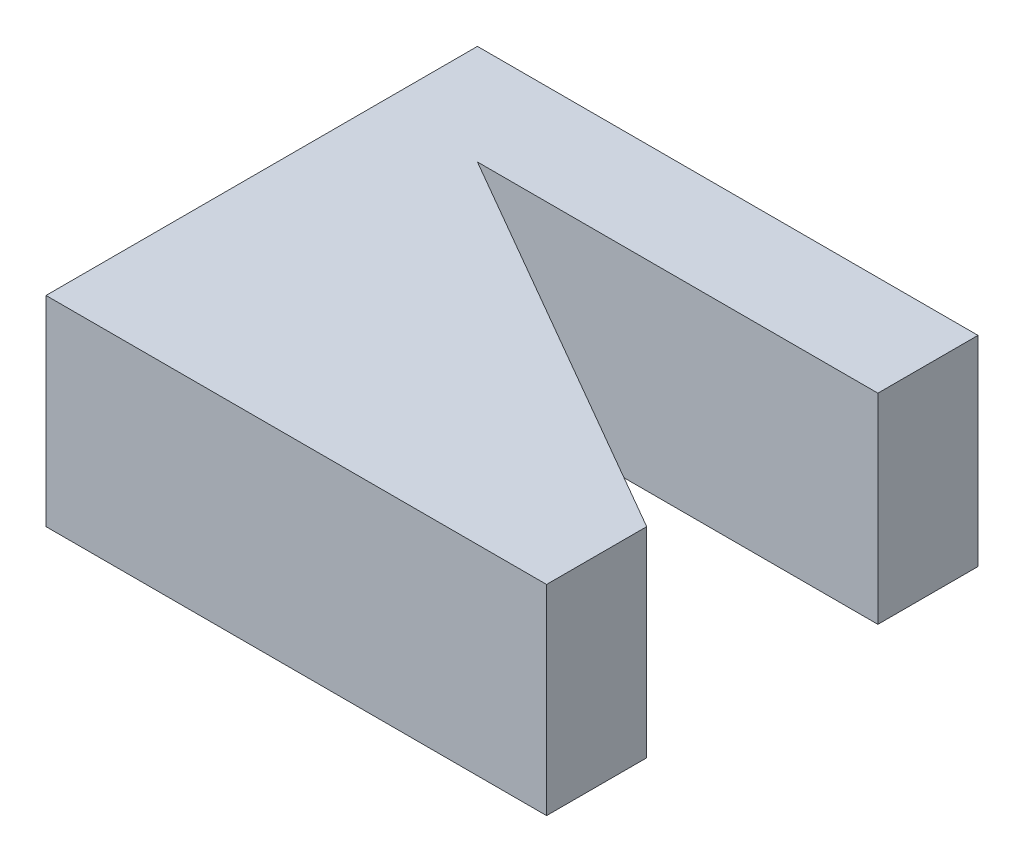
ISO-10303-21;
HEADER;
FILE_DESCRIPTION(('STEP AP214'),'2;1');
FILE_NAME('part.step','',(''),(''),'','','');
FILE_SCHEMA(('AUTOMOTIVE_DESIGN { 1 0 10303 214 1 1 1 1 }'));
ENDSEC;
DATA;
#1=APPLICATION_CONTEXT('core data for automotive mechanical design processes');
#2=APPLICATION_PROTOCOL_DEFINITION('international standard','automotive_design',2000,#1);
#3=PRODUCT_CONTEXT('',#1,'mechanical');
#4=PRODUCT('Part','Part','',(#3));
#5=PRODUCT_RELATED_PRODUCT_CATEGORY('part','',(#4));
#6=PRODUCT_DEFINITION_FORMATION('','',#4);
#7=PRODUCT_DEFINITION_CONTEXT('part definition',#1,'design');
#8=PRODUCT_DEFINITION('design','',#6,#7);
#9=PRODUCT_DEFINITION_SHAPE('','',#8);
#10=(LENGTH_UNIT() NAMED_UNIT(*) SI_UNIT(.MILLI.,.METRE.));
#11=(NAMED_UNIT(*) PLANE_ANGLE_UNIT() SI_UNIT($,.RADIAN.));
#12=(NAMED_UNIT(*) SI_UNIT($,.STERADIAN.) SOLID_ANGLE_UNIT());
#13=UNCERTAINTY_MEASURE_WITH_UNIT(LENGTH_MEASURE(1.E-05),#10,'distance_accuracy_value','');
#14=(GEOMETRIC_REPRESENTATION_CONTEXT(3) GLOBAL_UNCERTAINTY_ASSIGNED_CONTEXT((#13)) GLOBAL_UNIT_ASSIGNED_CONTEXT((#10,
#11,#12)) REPRESENTATION_CONTEXT('',''));
#15=CARTESIAN_POINT('',(0.,0.,0.));
#16=DIRECTION('',(0.,0.,1.));
#17=DIRECTION('',(1.,0.,0.));
#18=AXIS2_PLACEMENT_3D('',#15,#16,#17);
#19=CARTESIAN_POINT('',(10.,20.,10.));
#20=DIRECTION('',(0.,0.,-1.));
#21=DIRECTION('',(-1.,0.,0.));
#22=AXIS2_PLACEMENT_3D('',#19,#20,#21);
#23=PLANE('',#22);
#24=DIRECTION('',(1.,0.,0.));
#25=VECTOR('',#24,1.);
#26=CARTESIAN_POINT('',(10.,0.,10.));
#27=LINE('',#26,#25);
#28=CARTESIAN_POINT('',(10.,0.,10.));
#29=VERTEX_POINT('',#28);
#30=CARTESIAN_POINT('',(50.,0.,10.));
#31=VERTEX_POINT('',#30);
#32=EDGE_CURVE('E135',#29,#31,#27,.T.);
#33=ORIENTED_EDGE('',*,*,#32,.T.);
#34=DIRECTION('',(0.,-1.,0.));
#35=VECTOR('',#34,1.);
#36=CARTESIAN_POINT('',(50.,20.,10.));
#37=LINE('',#36,#35);
#38=CARTESIAN_POINT('',(50.,20.,10.));
#39=VERTEX_POINT('',#38);
#40=EDGE_CURVE('E11',#39,#31,#37,.T.);
#41=ORIENTED_EDGE('',*,*,#40,.F.);
#42=DIRECTION('',(1.,0.,0.));
#43=VECTOR('',#42,1.);
#44=CARTESIAN_POINT('',(10.,20.,10.));
#45=LINE('',#44,#43);
#46=CARTESIAN_POINT('',(10.,20.,10.));
#47=VERTEX_POINT('',#46);
#48=EDGE_CURVE('E156',#47,#39,#45,.T.);
#49=ORIENTED_EDGE('',*,*,#48,.F.);
#50=DIRECTION('',(0.,-1.,0.));
#51=VECTOR('',#50,1.);
#52=CARTESIAN_POINT('',(10.,20.,10.));
#53=LINE('',#52,#51);
#54=EDGE_CURVE('E56',#47,#29,#53,.T.);
#55=ORIENTED_EDGE('',*,*,#54,.T.);
#56=EDGE_LOOP('',(#33,#41,#49,#55));
#57=FACE_BOUND('',#56,.T.);
#58=ADVANCED_FACE('F39',(#57),#23,.F.);
#59=CARTESIAN_POINT('',(50.,20.,10.));
#60=DIRECTION('',(-1.,0.,0.));
#61=DIRECTION('',(0.,0.,1.));
#62=AXIS2_PLACEMENT_3D('',#59,#60,#61);
#63=PLANE('',#62);
#64=DIRECTION('',(0.,0.,-1.));
#65=VECTOR('',#64,1.);
#66=CARTESIAN_POINT('',(50.,0.,10.));
#67=LINE('',#66,#65);
#68=CARTESIAN_POINT('',(50.,0.,0.));
#69=VERTEX_POINT('',#68);
#70=EDGE_CURVE('E138',#31,#69,#67,.T.);
#71=ORIENTED_EDGE('',*,*,#70,.T.);
#72=DIRECTION('',(0.,-1.,0.));
#73=VECTOR('',#72,1.);
#74=CARTESIAN_POINT('',(50.,20.,0.));
#75=LINE('',#74,#73);
#76=CARTESIAN_POINT('',(50.,20.,0.));
#77=VERTEX_POINT('',#76);
#78=EDGE_CURVE('E48',#77,#69,#75,.T.);
#79=ORIENTED_EDGE('',*,*,#78,.F.);
#80=DIRECTION('',(0.,0.,-1.));
#81=VECTOR('',#80,1.);
#82=CARTESIAN_POINT('',(50.,20.,10.));
#83=LINE('',#82,#81);
#84=EDGE_CURVE('E92',#39,#77,#83,.T.);
#85=ORIENTED_EDGE('',*,*,#84,.F.);
#86=ORIENTED_EDGE('',*,*,#40,.T.);
#87=EDGE_LOOP('',(#71,#79,#85,#86));
#88=FACE_BOUND('',#87,.T.);
#89=ADVANCED_FACE('F187',(#88),#63,.F.);
#90=CARTESIAN_POINT('',(50.,20.,0.));
#91=DIRECTION('',(0.,0.,1.));
#92=DIRECTION('',(1.,0.,0.));
#93=AXIS2_PLACEMENT_3D('',#90,#91,#92);
#94=PLANE('',#93);
#95=DIRECTION('',(-1.,0.,0.));
#96=VECTOR('',#95,1.);
#97=CARTESIAN_POINT('',(50.,0.,0.));
#98=LINE('',#97,#96);
#99=CARTESIAN_POINT('',(0.,0.,0.));
#100=VERTEX_POINT('',#99);
#101=EDGE_CURVE('E141',#69,#100,#98,.T.);
#102=ORIENTED_EDGE('',*,*,#101,.T.);
#103=DIRECTION('',(0.,-1.,0.));
#104=VECTOR('',#103,1.);
#105=CARTESIAN_POINT('',(0.,20.,0.));
#106=LINE('',#105,#104);
#107=CARTESIAN_POINT('',(0.,20.,0.));
#108=VERTEX_POINT('',#107);
#109=EDGE_CURVE('E163',#108,#100,#106,.T.);
#110=ORIENTED_EDGE('',*,*,#109,.F.);
#111=DIRECTION('',(-1.,0.,0.));
#112=VECTOR('',#111,1.);
#113=CARTESIAN_POINT('',(50.,20.,0.));
#114=LINE('',#113,#112);
#115=EDGE_CURVE('E173',#77,#108,#114,.T.);
#116=ORIENTED_EDGE('',*,*,#115,.F.);
#117=ORIENTED_EDGE('',*,*,#78,.T.);
#118=EDGE_LOOP('',(#102,#110,#116,#117));
#119=FACE_BOUND('',#118,.T.);
#120=ADVANCED_FACE('F171',(#119),#94,.F.);
#121=CARTESIAN_POINT('',(0.,20.,0.));
#122=DIRECTION('',(1.,0.,0.));
#123=DIRECTION('',(0.,0.,-1.));
#124=AXIS2_PLACEMENT_3D('',#121,#122,#123);
#125=PLANE('',#124);
#126=DIRECTION('',(0.,0.,1.));
#127=VECTOR('',#126,1.);
#128=CARTESIAN_POINT('',(0.,0.,0.));
#129=LINE('',#128,#127);
#130=CARTESIAN_POINT('',(0.,0.,43.0940107675851));
#131=VERTEX_POINT('',#130);
#132=EDGE_CURVE('E144',#100,#131,#129,.T.);
#133=ORIENTED_EDGE('',*,*,#132,.T.);
#134=DIRECTION('',(0.,-1.,0.));
#135=VECTOR('',#134,1.);
#136=CARTESIAN_POINT('',(0.,20.,43.0940107675851));
#137=LINE('',#136,#135);
#138=CARTESIAN_POINT('',(0.,20.,43.0940107675851));
#139=VERTEX_POINT('',#138);
#140=EDGE_CURVE('E125',#139,#131,#137,.T.);
#141=ORIENTED_EDGE('',*,*,#140,.F.);
#142=DIRECTION('',(0.,0.,1.));
#143=VECTOR('',#142,1.);
#144=CARTESIAN_POINT('',(0.,20.,0.));
#145=LINE('',#144,#143);
#146=EDGE_CURVE('E111',#108,#139,#145,.T.);
#147=ORIENTED_EDGE('',*,*,#146,.F.);
#148=ORIENTED_EDGE('',*,*,#109,.T.);
#149=EDGE_LOOP('',(#133,#141,#147,#148));
#150=FACE_BOUND('',#149,.T.);
#151=ADVANCED_FACE('F178',(#150),#125,.F.);
#152=CARTESIAN_POINT('',(0.,20.,43.0940107675851));
#153=DIRECTION('',(0.,0.,-1.));
#154=DIRECTION('',(-1.,0.,0.));
#155=AXIS2_PLACEMENT_3D('',#152,#153,#154);
#156=PLANE('',#155);
#157=DIRECTION('',(1.,0.,0.));
#158=VECTOR('',#157,1.);
#159=CARTESIAN_POINT('',(0.,0.,43.0940107675851));
#160=LINE('',#159,#158);
#161=CARTESIAN_POINT('',(50.,0.,43.0940107675851));
#162=VERTEX_POINT('',#161);
#163=EDGE_CURVE('E121',#131,#162,#160,.T.);
#164=ORIENTED_EDGE('',*,*,#163,.T.);
#165=DIRECTION('',(0.,-1.,0.));
#166=VECTOR('',#165,1.);
#167=CARTESIAN_POINT('',(50.,20.,43.0940107675851));
#168=LINE('',#167,#166);
#169=CARTESIAN_POINT('',(50.,20.,43.0940107675851));
#170=VERTEX_POINT('',#169);
#171=EDGE_CURVE('E118',#170,#162,#168,.T.);
#172=ORIENTED_EDGE('',*,*,#171,.F.);
#173=DIRECTION('',(1.,0.,0.));
#174=VECTOR('',#173,1.);
#175=CARTESIAN_POINT('',(0.,20.,43.0940107675851));
#176=LINE('',#175,#174);
#177=EDGE_CURVE('E104',#139,#170,#176,.T.);
#178=ORIENTED_EDGE('',*,*,#177,.F.);
#179=ORIENTED_EDGE('',*,*,#140,.T.);
#180=EDGE_LOOP('',(#164,#172,#178,#179));
#181=FACE_BOUND('',#180,.T.);
#182=ADVANCED_FACE('F119',(#181),#156,.F.);
#183=CARTESIAN_POINT('',(50.,20.,43.0940107675851));
#184=DIRECTION('',(-1.,0.,0.));
#185=DIRECTION('',(0.,0.,1.));
#186=AXIS2_PLACEMENT_3D('',#183,#184,#185);
#187=PLANE('',#186);
#188=DIRECTION('',(0.,0.,-1.));
#189=VECTOR('',#188,1.);
#190=CARTESIAN_POINT('',(50.,0.,43.0940107675851));
#191=LINE('',#190,#189);
#192=CARTESIAN_POINT('',(50.,0.,33.0940107675851));
#193=VERTEX_POINT('',#192);
#194=EDGE_CURVE('E149',#162,#193,#191,.T.);
#195=ORIENTED_EDGE('',*,*,#194,.T.);
#196=DIRECTION('',(0.,-1.,0.));
#197=VECTOR('',#196,1.);
#198=CARTESIAN_POINT('',(50.,20.,33.0940107675851));
#199=LINE('',#198,#197);
#200=CARTESIAN_POINT('',(50.,20.,33.0940107675851));
#201=VERTEX_POINT('',#200);
#202=EDGE_CURVE('E80',#201,#193,#199,.T.);
#203=ORIENTED_EDGE('',*,*,#202,.F.);
#204=DIRECTION('',(0.,0.,-1.));
#205=VECTOR('',#204,1.);
#206=CARTESIAN_POINT('',(50.,20.,43.0940107675851));
#207=LINE('',#206,#205);
#208=EDGE_CURVE('E109',#170,#201,#207,.T.);
#209=ORIENTED_EDGE('',*,*,#208,.F.);
#210=ORIENTED_EDGE('',*,*,#171,.T.);
#211=EDGE_LOOP('',(#195,#203,#209,#210));
#212=FACE_BOUND('',#211,.T.);
#213=ADVANCED_FACE('F127',(#212),#187,.F.);
#214=CARTESIAN_POINT('',(10.,20.,10.));
#215=DIRECTION('',(0.500000000000001,0.,-0.866025403784438));
#216=DIRECTION('',(-0.866025403784438,0.,-0.500000000000001));
#217=AXIS2_PLACEMENT_3D('',#214,#215,#216);
#218=PLANE('',#217);
#219=DIRECTION('',(0.866025403784438,0.,0.500000000000001));
#220=VECTOR('',#219,1.);
#221=CARTESIAN_POINT('',(10.,0.,10.));
#222=LINE('',#221,#220);
#223=EDGE_CURVE('E152',#29,#193,#222,.T.);
#224=ORIENTED_EDGE('',*,*,#223,.F.);
#225=ORIENTED_EDGE('',*,*,#54,.F.);
#226=DIRECTION('',(0.866025403784438,0.,0.500000000000001));
#227=VECTOR('',#226,1.);
#228=CARTESIAN_POINT('',(10.,20.,10.));
#229=LINE('',#228,#227);
#230=EDGE_CURVE('E129',#47,#201,#229,.T.);
#231=ORIENTED_EDGE('',*,*,#230,.T.);
#232=ORIENTED_EDGE('',*,*,#202,.T.);
#233=EDGE_LOOP('',(#224,#225,#231,#232));
#234=FACE_BOUND('',#233,.T.);
#235=ADVANCED_FACE('F201',(#234),#218,.T.);
#236=CARTESIAN_POINT('',(0.,20.,0.));
#237=DIRECTION('',(0.,1.,0.));
#238=DIRECTION('',(0.,0.,1.));
#239=AXIS2_PLACEMENT_3D('',#236,#237,#238);
#240=PLANE('',#239);
#241=ORIENTED_EDGE('',*,*,#48,.T.);
#242=ORIENTED_EDGE('',*,*,#84,.T.);
#243=ORIENTED_EDGE('',*,*,#115,.T.);
#244=ORIENTED_EDGE('',*,*,#146,.T.);
#245=ORIENTED_EDGE('',*,*,#177,.T.);
#246=ORIENTED_EDGE('',*,*,#208,.T.);
#247=ORIENTED_EDGE('',*,*,#230,.F.);
#248=EDGE_LOOP('',(#241,#242,#243,#244,#245,#246,#247));
#249=FACE_BOUND('',#248,.T.);
#250=ADVANCED_FACE('F106',(#249),#240,.T.);
#251=CARTESIAN_POINT('',(0.,0.,0.));
#252=DIRECTION('',(0.,1.,0.));
#253=DIRECTION('',(0.,0.,1.));
#254=AXIS2_PLACEMENT_3D('',#251,#252,#253);
#255=PLANE('',#254);
#256=ORIENTED_EDGE('',*,*,#32,.F.);
#257=ORIENTED_EDGE('',*,*,#223,.T.);
#258=ORIENTED_EDGE('',*,*,#194,.F.);
#259=ORIENTED_EDGE('',*,*,#163,.F.);
#260=ORIENTED_EDGE('',*,*,#132,.F.);
#261=ORIENTED_EDGE('',*,*,#101,.F.);
#262=ORIENTED_EDGE('',*,*,#70,.F.);
#263=EDGE_LOOP('',(#256,#257,#258,#259,#260,#261,#262));
#264=FACE_BOUND('',#263,.T.);
#265=ADVANCED_FACE('F176',(#264),#255,.F.);
#266=CLOSED_SHELL('',(#58,#89,#120,#151,#182,#213,#235,#250,#265));
#267=MANIFOLD_SOLID_BREP('B2',#266);
#268=ADVANCED_BREP_SHAPE_REPRESENTATION('',(#18,#267),#14);
#269=SHAPE_DEFINITION_REPRESENTATION(#9,#268);
ENDSEC;
END-ISO-10303-21;
